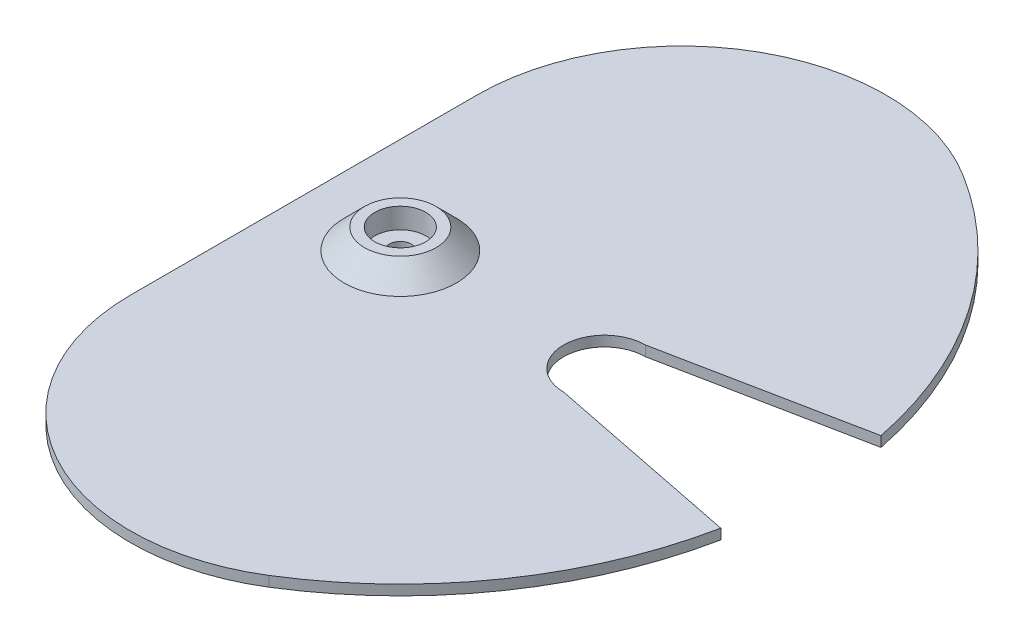
ISO-10303-21;
HEADER;
FILE_DESCRIPTION(('STEP AP214'),'2;1');
FILE_NAME('part.step','',(''),(''),'','','');
FILE_SCHEMA(('AUTOMOTIVE_DESIGN { 1 0 10303 214 1 1 1 1 }'));
ENDSEC;
DATA;
#1=APPLICATION_CONTEXT('core data for automotive mechanical design processes');
#2=APPLICATION_PROTOCOL_DEFINITION('international standard','automotive_design',2000,#1);
#3=PRODUCT_CONTEXT('',#1,'mechanical');
#4=PRODUCT('Part','Part','',(#3));
#5=PRODUCT_RELATED_PRODUCT_CATEGORY('part','',(#4));
#6=PRODUCT_DEFINITION_FORMATION('','',#4);
#7=PRODUCT_DEFINITION_CONTEXT('part definition',#1,'design');
#8=PRODUCT_DEFINITION('design','',#6,#7);
#9=PRODUCT_DEFINITION_SHAPE('','',#8);
#10=(LENGTH_UNIT() NAMED_UNIT(*) SI_UNIT(.MILLI.,.METRE.));
#11=(NAMED_UNIT(*) PLANE_ANGLE_UNIT() SI_UNIT($,.RADIAN.));
#12=(NAMED_UNIT(*) SI_UNIT($,.STERADIAN.) SOLID_ANGLE_UNIT());
#13=UNCERTAINTY_MEASURE_WITH_UNIT(LENGTH_MEASURE(1.E-05),#10,'distance_accuracy_value','');
#14=(GEOMETRIC_REPRESENTATION_CONTEXT(3) GLOBAL_UNCERTAINTY_ASSIGNED_CONTEXT((#13)) GLOBAL_UNIT_ASSIGNED_CONTEXT((#10,
#11,#12)) REPRESENTATION_CONTEXT('',''));
#15=CARTESIAN_POINT('',(0.,0.,0.));
#16=DIRECTION('',(0.,0.,1.));
#17=DIRECTION('',(1.,0.,0.));
#18=AXIS2_PLACEMENT_3D('',#15,#16,#17);
#19=CARTESIAN_POINT('',(10.5597706627085,1.,16.9850299838123));
#20=DIRECTION('',(0.,-1.,0.));
#21=DIRECTION('',(0.,0.,-1.));
#22=AXIS2_PLACEMENT_3D('',#19,#20,#21);
#23=CYLINDRICAL_SURFACE('',#22,20.);
#24=DIRECTION('',(0.,-1.,0.));
#25=VECTOR('',#24,1.);
#26=CARTESIAN_POINT('',(-9.44022933729153,-2.,16.9850299838123));
#27=LINE('',#26,#25);
#28=CARTESIAN_POINT('',(-9.44022933729153,0.,16.9850299838123));
#29=VERTEX_POINT('',#28);
#30=CARTESIAN_POINT('',(-9.44022933729153,1.,16.9850299838123));
#31=VERTEX_POINT('',#30);
#32=EDGE_CURVE('E172',#29,#31,#27,.F.);
#33=ORIENTED_EDGE('',*,*,#32,.F.);
#34=CARTESIAN_POINT('',(10.5597706627085,0.,16.9850299838123));
#35=DIRECTION('',(0.,1.,0.));
#36=DIRECTION('',(0.,0.,1.));
#37=AXIS2_PLACEMENT_3D('',#34,#35,#36);
#38=CIRCLE('',#37,20.);
#39=CARTESIAN_POINT('',(21.1195413254169,0.,33.9700599676245));
#40=VERTEX_POINT('',#39);
#41=EDGE_CURVE('E40',#40,#29,#38,.F.);
#42=ORIENTED_EDGE('',*,*,#41,.F.);
#43=DIRECTION('',(0.,-1.,0.));
#44=VECTOR('',#43,1.);
#45=CARTESIAN_POINT('',(21.1195413254169,1.,33.9700599676245));
#46=LINE('',#45,#44);
#47=CARTESIAN_POINT('',(21.1195413254169,1.,33.9700599676245));
#48=VERTEX_POINT('',#47);
#49=EDGE_CURVE('E175',#48,#40,#46,.T.);
#50=ORIENTED_EDGE('',*,*,#49,.F.);
#51=CARTESIAN_POINT('',(10.5597706627085,1.,16.9850299838123));
#52=DIRECTION('',(0.,1.,0.));
#53=DIRECTION('',(0.,0.,1.));
#54=AXIS2_PLACEMENT_3D('',#51,#52,#53);
#55=CIRCLE('',#54,20.);
#56=EDGE_CURVE('E11',#31,#48,#55,.T.);
#57=ORIENTED_EDGE('',*,*,#56,.F.);
#58=EDGE_LOOP('',(#33,#42,#50,#57));
#59=FACE_BOUND('',#58,.T.);
#60=ADVANCED_FACE('F33',(#59),#23,.T.);
#61=CARTESIAN_POINT('',(10.5597706627085,1.,-16.9850299838123));
#62=DIRECTION('',(0.,-1.,0.));
#63=DIRECTION('',(0.,0.,-1.));
#64=AXIS2_PLACEMENT_3D('',#61,#62,#63);
#65=CYLINDRICAL_SURFACE('',#64,20.);
#66=DIRECTION('',(0.,-1.,0.));
#67=VECTOR('',#66,1.);
#68=CARTESIAN_POINT('',(21.1195413254169,1.,-33.9700599676245));
#69=LINE('',#68,#67);
#70=CARTESIAN_POINT('',(21.119541325417,0.,-33.9700599676245));
#71=VERTEX_POINT('',#70);
#72=CARTESIAN_POINT('',(21.119541325417,1.,-33.9700599676245));
#73=VERTEX_POINT('',#72);
#74=EDGE_CURVE('E161',#71,#73,#69,.F.);
#75=ORIENTED_EDGE('',*,*,#74,.F.);
#76=CARTESIAN_POINT('',(10.5597706627085,0.,-16.9850299838123));
#77=DIRECTION('',(0.,1.,0.));
#78=DIRECTION('',(0.,0.,1.));
#79=AXIS2_PLACEMENT_3D('',#76,#77,#78);
#80=CIRCLE('',#79,20.);
#81=CARTESIAN_POINT('',(-9.44022933729153,0.,-16.9850299838123));
#82=VERTEX_POINT('',#81);
#83=EDGE_CURVE('E167',#82,#71,#80,.F.);
#84=ORIENTED_EDGE('',*,*,#83,.F.);
#85=DIRECTION('',(0.,-1.,0.));
#86=VECTOR('',#85,1.);
#87=CARTESIAN_POINT('',(-9.44022933729153,-2.,-16.9850299838123));
#88=LINE('',#87,#86);
#89=CARTESIAN_POINT('',(-9.44022933729153,1.,-16.9850299838123));
#90=VERTEX_POINT('',#89);
#91=EDGE_CURVE('E164',#90,#82,#88,.T.);
#92=ORIENTED_EDGE('',*,*,#91,.F.);
#93=CARTESIAN_POINT('',(10.5597706627085,1.,-16.9850299838123));
#94=DIRECTION('',(0.,1.,0.));
#95=DIRECTION('',(0.,0.,1.));
#96=AXIS2_PLACEMENT_3D('',#93,#94,#95);
#97=CIRCLE('',#96,20.);
#98=EDGE_CURVE('E169',#73,#90,#97,.T.);
#99=ORIENTED_EDGE('',*,*,#98,.F.);
#100=EDGE_LOOP('',(#75,#84,#92,#99));
#101=FACE_BOUND('',#100,.T.);
#102=ADVANCED_FACE('F186',(#101),#65,.T.);
#103=CARTESIAN_POINT('',(0.,1.,0.));
#104=DIRECTION('',(0.,-1.,0.));
#105=DIRECTION('',(0.,0.,-1.));
#106=AXIS2_PLACEMENT_3D('',#103,#104,#105);
#107=CYLINDRICAL_SURFACE('',#106,40.);
#108=CARTESIAN_POINT('',(0.,0.,0.));
#109=DIRECTION('',(0.,1.,0.));
#110=DIRECTION('',(0.,0.,1.));
#111=AXIS2_PLACEMENT_3D('',#108,#109,#110);
#112=CIRCLE('',#111,40.);
#113=CARTESIAN_POINT('',(39.2232270276368,0.,-7.84464540552736));
#114=VERTEX_POINT('',#113);
#115=EDGE_CURVE('E148',#114,#71,#112,.T.);
#116=ORIENTED_EDGE('',*,*,#115,.T.);
#117=ORIENTED_EDGE('',*,*,#74,.T.);
#118=CARTESIAN_POINT('',(0.,1.,0.));
#119=DIRECTION('',(0.,1.,0.));
#120=DIRECTION('',(0.,0.,1.));
#121=AXIS2_PLACEMENT_3D('',#118,#119,#120);
#122=CIRCLE('',#121,40.);
#123=CARTESIAN_POINT('',(39.2232270276368,1.,-7.84464540552736));
#124=VERTEX_POINT('',#123);
#125=EDGE_CURVE('E144',#124,#73,#122,.T.);
#126=ORIENTED_EDGE('',*,*,#125,.F.);
#127=DIRECTION('',(0.,1.,0.));
#128=VECTOR('',#127,1.);
#129=CARTESIAN_POINT('',(39.2232270276368,-2.,-7.84464540552736));
#130=LINE('',#129,#128);
#131=EDGE_CURVE('E111',#114,#124,#130,.T.);
#132=ORIENTED_EDGE('',*,*,#131,.F.);
#133=EDGE_LOOP('',(#116,#117,#126,#132));
#134=FACE_BOUND('',#133,.T.);
#135=ADVANCED_FACE('F189',(#134),#107,.T.);
#136=CARTESIAN_POINT('',(39.2232270276368,1.,7.84464540552736));
#137=VERTEX_POINT('',#136);
#138=EDGE_CURVE('E147',#48,#137,#122,.T.);
#139=ORIENTED_EDGE('',*,*,#138,.F.);
#140=ORIENTED_EDGE('',*,*,#49,.T.);
#141=CARTESIAN_POINT('',(39.2232270276368,0.,7.84464540552736));
#142=VERTEX_POINT('',#141);
#143=EDGE_CURVE('E143',#40,#142,#112,.T.);
#144=ORIENTED_EDGE('',*,*,#143,.T.);
#145=DIRECTION('',(0.,1.,0.));
#146=VECTOR('',#145,1.);
#147=CARTESIAN_POINT('',(39.2232270276368,-2.,7.84464540552736));
#148=LINE('',#147,#146);
#149=EDGE_CURVE('E125',#142,#137,#148,.T.);
#150=ORIENTED_EDGE('',*,*,#149,.T.);
#151=EDGE_LOOP('',(#139,#140,#144,#150));
#152=FACE_BOUND('',#151,.T.);
#153=ADVANCED_FACE('F191',(#152),#107,.T.);
#154=CARTESIAN_POINT('',(0.,1.,0.));
#155=DIRECTION('',(0.,1.,0.));
#156=DIRECTION('',(0.,0.,1.));
#157=AXIS2_PLACEMENT_3D('',#154,#155,#156);
#158=PLANE('',#157);
#159=DIRECTION('',(0.,0.,-1.));
#160=VECTOR('',#159,1.);
#161=CARTESIAN_POINT('',(-9.44022933729153,1.,-38.8700665044368));
#162=LINE('',#161,#160);
#163=EDGE_CURVE('E114',#31,#90,#162,.T.);
#164=ORIENTED_EDGE('',*,*,#163,.F.);
#165=ORIENTED_EDGE('',*,*,#56,.T.);
#166=ORIENTED_EDGE('',*,*,#138,.T.);
#167=DIRECTION('',(0.98058067569092,0.,0.196116135138184));
#168=VECTOR('',#167,1.);
#169=CARTESIAN_POINT('',(0.,1.,0.));
#170=LINE('',#169,#168);
#171=CARTESIAN_POINT('',(20.,1.,4.));
#172=VERTEX_POINT('',#171);
#173=EDGE_CURVE('E105',#172,#137,#170,.T.);
#174=ORIENTED_EDGE('',*,*,#173,.F.);
#175=CARTESIAN_POINT('',(20.,1.,0.));
#176=DIRECTION('',(0.,1.,0.));
#177=DIRECTION('',(0.,0.,1.));
#178=AXIS2_PLACEMENT_3D('',#175,#176,#177);
#179=CIRCLE('',#178,4.);
#180=CARTESIAN_POINT('',(20.,1.,-4.));
#181=VERTEX_POINT('',#180);
#182=EDGE_CURVE('E98',#181,#172,#179,.T.);
#183=ORIENTED_EDGE('',*,*,#182,.F.);
#184=DIRECTION('',(0.98058067569092,0.,-0.196116135138184));
#185=VECTOR('',#184,1.);
#186=CARTESIAN_POINT('',(0.,1.,0.));
#187=LINE('',#186,#185);
#188=EDGE_CURVE('E108',#181,#124,#187,.T.);
#189=ORIENTED_EDGE('',*,*,#188,.T.);
#190=ORIENTED_EDGE('',*,*,#125,.T.);
#191=ORIENTED_EDGE('',*,*,#98,.T.);
#192=EDGE_LOOP('',(#164,#165,#166,#174,#183,#189,#190,#191));
#193=FACE_BOUND('',#192,.T.);
#194=CARTESIAN_POINT('',(0.,1.,0.));
#195=DIRECTION('',(0.,1.,0.));
#196=DIRECTION('',(0.,0.,1.));
#197=AXIS2_PLACEMENT_3D('',#194,#195,#196);
#198=CIRCLE('',#197,5.49999999999998);
#199=CARTESIAN_POINT('',(0.,1.,5.49999999999998));
#200=VERTEX_POINT('',#199);
#201=EDGE_CURVE('E146',#200,#200,#198,.F.);
#202=ORIENTED_EDGE('',*,*,#201,.T.);
#203=EDGE_LOOP('',(#202));
#204=FACE_BOUND('',#203,.T.);
#205=ADVANCED_FACE('F116',(#193,#204),#158,.T.);
#206=CARTESIAN_POINT('',(0.,0.,0.));
#207=DIRECTION('',(0.,1.,0.));
#208=DIRECTION('',(0.,0.,1.));
#209=AXIS2_PLACEMENT_3D('',#206,#207,#208);
#210=PLANE('',#209);
#211=CARTESIAN_POINT('',(0.,0.,0.));
#212=DIRECTION('',(0.,1.,0.));
#213=DIRECTION('',(0.,0.,1.));
#214=AXIS2_PLACEMENT_3D('',#211,#212,#213);
#215=CIRCLE('',#214,1.1);
#216=CARTESIAN_POINT('',(0.,0.,1.1));
#217=VERTEX_POINT('',#216);
#218=EDGE_CURVE('E131',#217,#217,#215,.T.);
#219=ORIENTED_EDGE('',*,*,#218,.T.);
#220=EDGE_LOOP('',(#219));
#221=FACE_BOUND('',#220,.T.);
#222=ORIENTED_EDGE('',*,*,#143,.F.);
#223=ORIENTED_EDGE('',*,*,#41,.T.);
#224=DIRECTION('',(0.,0.,-1.));
#225=VECTOR('',#224,1.);
#226=CARTESIAN_POINT('',(-9.44022933729153,0.,0.));
#227=LINE('',#226,#225);
#228=EDGE_CURVE('E159',#29,#82,#227,.T.);
#229=ORIENTED_EDGE('',*,*,#228,.T.);
#230=ORIENTED_EDGE('',*,*,#83,.T.);
#231=ORIENTED_EDGE('',*,*,#115,.F.);
#232=DIRECTION('',(0.98058067569092,0.,-0.196116135138184));
#233=VECTOR('',#232,1.);
#234=CARTESIAN_POINT('',(0.,0.,0.));
#235=LINE('',#234,#233);
#236=CARTESIAN_POINT('',(20.,0.,-4.));
#237=VERTEX_POINT('',#236);
#238=EDGE_CURVE('E157',#237,#114,#235,.T.);
#239=ORIENTED_EDGE('',*,*,#238,.F.);
#240=CARTESIAN_POINT('',(20.,0.,0.));
#241=DIRECTION('',(0.,1.,0.));
#242=DIRECTION('',(0.,0.,1.));
#243=AXIS2_PLACEMENT_3D('',#240,#241,#242);
#244=CIRCLE('',#243,4.);
#245=CARTESIAN_POINT('',(20.,0.,4.));
#246=VERTEX_POINT('',#245);
#247=EDGE_CURVE('E101',#237,#246,#244,.T.);
#248=ORIENTED_EDGE('',*,*,#247,.T.);
#249=DIRECTION('',(0.98058067569092,0.,0.196116135138184));
#250=VECTOR('',#249,1.);
#251=CARTESIAN_POINT('',(0.,0.,0.));
#252=LINE('',#251,#250);
#253=EDGE_CURVE('E154',#246,#142,#252,.T.);
#254=ORIENTED_EDGE('',*,*,#253,.T.);
#255=EDGE_LOOP('',(#222,#223,#229,#230,#231,#239,#248,#254));
#256=FACE_BOUND('',#255,.T.);
#257=ADVANCED_FACE('F178',(#221,#256),#210,.F.);
#258=CARTESIAN_POINT('',(0.,3.,0.));
#259=DIRECTION('',(0.,1.,0.));
#260=DIRECTION('',(0.,0.,1.));
#261=AXIS2_PLACEMENT_3D('',#258,#259,#260);
#262=PLANE('',#261);
#263=CARTESIAN_POINT('',(0.,3.,0.));
#264=DIRECTION('',(0.,1.,0.));
#265=DIRECTION('',(0.,0.,1.));
#266=AXIS2_PLACEMENT_3D('',#263,#264,#265);
#267=CIRCLE('',#266,2.5);
#268=CARTESIAN_POINT('',(0.,3.,2.5));
#269=VERTEX_POINT('',#268);
#270=EDGE_CURVE('E134',#269,#269,#267,.T.);
#271=ORIENTED_EDGE('',*,*,#270,.F.);
#272=EDGE_LOOP('',(#271));
#273=FACE_BOUND('',#272,.T.);
#274=CARTESIAN_POINT('',(0.,3.,0.));
#275=DIRECTION('',(0.,1.,0.));
#276=DIRECTION('',(0.,0.,1.));
#277=AXIS2_PLACEMENT_3D('',#274,#275,#276);
#278=CIRCLE('',#277,3.5);
#279=CARTESIAN_POINT('',(0.,3.,3.5));
#280=VERTEX_POINT('',#279);
#281=EDGE_CURVE('E138',#280,#280,#278,.T.);
#282=ORIENTED_EDGE('',*,*,#281,.T.);
#283=EDGE_LOOP('',(#282));
#284=FACE_BOUND('',#283,.T.);
#285=ADVANCED_FACE('F237',(#273,#284),#262,.T.);
#286=CARTESIAN_POINT('',(0.,1.,0.));
#287=DIRECTION('',(0.,1.,0.));
#288=DIRECTION('',(0.,0.,1.));
#289=AXIS2_PLACEMENT_3D('',#286,#287,#288);
#290=CYLINDRICAL_SURFACE('',#289,2.5);
#291=CARTESIAN_POINT('',(0.,1.,0.));
#292=DIRECTION('',(0.,1.,0.));
#293=DIRECTION('',(0.,0.,1.));
#294=AXIS2_PLACEMENT_3D('',#291,#292,#293);
#295=CIRCLE('',#294,2.5);
#296=CARTESIAN_POINT('',(0.,1.,2.5));
#297=VERTEX_POINT('',#296);
#298=EDGE_CURVE('E135',#297,#297,#295,.T.);
#299=ORIENTED_EDGE('',*,*,#298,.F.);
#300=EDGE_LOOP('',(#299));
#301=FACE_BOUND('',#300,.T.);
#302=ORIENTED_EDGE('',*,*,#270,.T.);
#303=EDGE_LOOP('',(#302));
#304=FACE_BOUND('',#303,.T.);
#305=ADVANCED_FACE('F284',(#301,#304),#290,.F.);
#306=CARTESIAN_POINT('',(0.,1.,0.));
#307=DIRECTION('',(0.,1.,0.));
#308=DIRECTION('',(0.,0.,1.));
#309=AXIS2_PLACEMENT_3D('',#306,#307,#308);
#310=PLANE('',#309);
#311=CARTESIAN_POINT('',(0.,1.,0.));
#312=DIRECTION('',(0.,1.,0.));
#313=DIRECTION('',(0.,0.,1.));
#314=AXIS2_PLACEMENT_3D('',#311,#312,#313);
#315=CIRCLE('',#314,1.1);
#316=CARTESIAN_POINT('',(0.,1.,1.1));
#317=VERTEX_POINT('',#316);
#318=EDGE_CURVE('E124',#317,#317,#315,.T.);
#319=ORIENTED_EDGE('',*,*,#318,.F.);
#320=EDGE_LOOP('',(#319));
#321=FACE_BOUND('',#320,.T.);
#322=ORIENTED_EDGE('',*,*,#298,.T.);
#323=EDGE_LOOP('',(#322));
#324=FACE_BOUND('',#323,.T.);
#325=ADVANCED_FACE('F281',(#321,#324),#310,.T.);
#326=CARTESIAN_POINT('',(0.,3.,0.));
#327=DIRECTION('',(0.,-1.,0.));
#328=DIRECTION('',(0.,0.,-1.));
#329=AXIS2_PLACEMENT_3D('',#326,#327,#328);
#330=CONICAL_SURFACE('',#329,3.5,0.785398163397444);
#331=ORIENTED_EDGE('',*,*,#201,.F.);
#332=EDGE_LOOP('',(#331));
#333=FACE_BOUND('',#332,.T.);
#334=ORIENTED_EDGE('',*,*,#281,.F.);
#335=EDGE_LOOP('',(#334));
#336=FACE_BOUND('',#335,.T.);
#337=ADVANCED_FACE('F279',(#333,#336),#330,.T.);
#338=CARTESIAN_POINT('',(0.,-2.,0.));
#339=DIRECTION('',(0.,1.,0.));
#340=DIRECTION('',(0.,0.,1.));
#341=AXIS2_PLACEMENT_3D('',#338,#339,#340);
#342=CYLINDRICAL_SURFACE('',#341,1.1);
#343=ORIENTED_EDGE('',*,*,#318,.T.);
#344=EDGE_LOOP('',(#343));
#345=FACE_BOUND('',#344,.T.);
#346=ORIENTED_EDGE('',*,*,#218,.F.);
#347=EDGE_LOOP('',(#346));
#348=FACE_BOUND('',#347,.T.);
#349=ADVANCED_FACE('F262',(#345,#348),#342,.F.);
#350=CARTESIAN_POINT('',(0.,-2.,0.));
#351=DIRECTION('',(0.196116135138184,0.,0.98058067569092));
#352=DIRECTION('',(0.98058067569092,0.,-0.196116135138184));
#353=AXIS2_PLACEMENT_3D('',#350,#351,#352);
#354=PLANE('',#353);
#355=ORIENTED_EDGE('',*,*,#238,.T.);
#356=ORIENTED_EDGE('',*,*,#131,.T.);
#357=ORIENTED_EDGE('',*,*,#188,.F.);
#358=DIRECTION('',(0.,1.,0.));
#359=VECTOR('',#358,1.);
#360=CARTESIAN_POINT('',(20.,-2.,-4.));
#361=LINE('',#360,#359);
#362=EDGE_CURVE('E94',#237,#181,#361,.T.);
#363=ORIENTED_EDGE('',*,*,#362,.F.);
#364=EDGE_LOOP('',(#355,#356,#357,#363));
#365=FACE_BOUND('',#364,.T.);
#366=ADVANCED_FACE('F109',(#365),#354,.T.);
#367=CARTESIAN_POINT('',(0.,-2.,0.));
#368=DIRECTION('',(-0.196116135138184,0.,0.98058067569092));
#369=DIRECTION('',(0.98058067569092,0.,0.196116135138184));
#370=AXIS2_PLACEMENT_3D('',#367,#368,#369);
#371=PLANE('',#370);
#372=DIRECTION('',(0.,1.,0.));
#373=VECTOR('',#372,1.);
#374=CARTESIAN_POINT('',(20.,-2.,4.));
#375=LINE('',#374,#373);
#376=EDGE_CURVE('E104',#246,#172,#375,.T.);
#377=ORIENTED_EDGE('',*,*,#376,.T.);
#378=ORIENTED_EDGE('',*,*,#173,.T.);
#379=ORIENTED_EDGE('',*,*,#149,.F.);
#380=ORIENTED_EDGE('',*,*,#253,.F.);
#381=EDGE_LOOP('',(#377,#378,#379,#380));
#382=FACE_BOUND('',#381,.T.);
#383=ADVANCED_FACE('F261',(#382),#371,.F.);
#384=CARTESIAN_POINT('',(20.,-2.,0.));
#385=DIRECTION('',(0.,1.,0.));
#386=DIRECTION('',(0.,0.,1.));
#387=AXIS2_PLACEMENT_3D('',#384,#385,#386);
#388=CYLINDRICAL_SURFACE('',#387,4.);
#389=ORIENTED_EDGE('',*,*,#362,.T.);
#390=ORIENTED_EDGE('',*,*,#182,.T.);
#391=ORIENTED_EDGE('',*,*,#376,.F.);
#392=ORIENTED_EDGE('',*,*,#247,.F.);
#393=EDGE_LOOP('',(#389,#390,#391,#392));
#394=FACE_BOUND('',#393,.T.);
#395=ADVANCED_FACE('F96',(#394),#388,.F.);
#396=CARTESIAN_POINT('',(-9.44022933729153,-2.,-38.8700665044368));
#397=DIRECTION('',(1.,0.,0.));
#398=DIRECTION('',(0.,0.,-1.));
#399=AXIS2_PLACEMENT_3D('',#396,#397,#398);
#400=PLANE('',#399);
#401=ORIENTED_EDGE('',*,*,#228,.F.);
#402=ORIENTED_EDGE('',*,*,#32,.T.);
#403=ORIENTED_EDGE('',*,*,#163,.T.);
#404=ORIENTED_EDGE('',*,*,#91,.T.);
#405=EDGE_LOOP('',(#401,#402,#403,#404));
#406=FACE_BOUND('',#405,.T.);
#407=ADVANCED_FACE('F182',(#406),#400,.F.);
#408=CLOSED_SHELL('',(#60,#102,#135,#153,#205,#257,#285,#305,#325,#337,#349,#366,#383,#395,#407));
#409=MANIFOLD_SOLID_BREP('B2',#408);
#410=ADVANCED_BREP_SHAPE_REPRESENTATION('',(#18,#409),#14);
#411=SHAPE_DEFINITION_REPRESENTATION(#9,#410);
ENDSEC;
END-ISO-10303-21;
